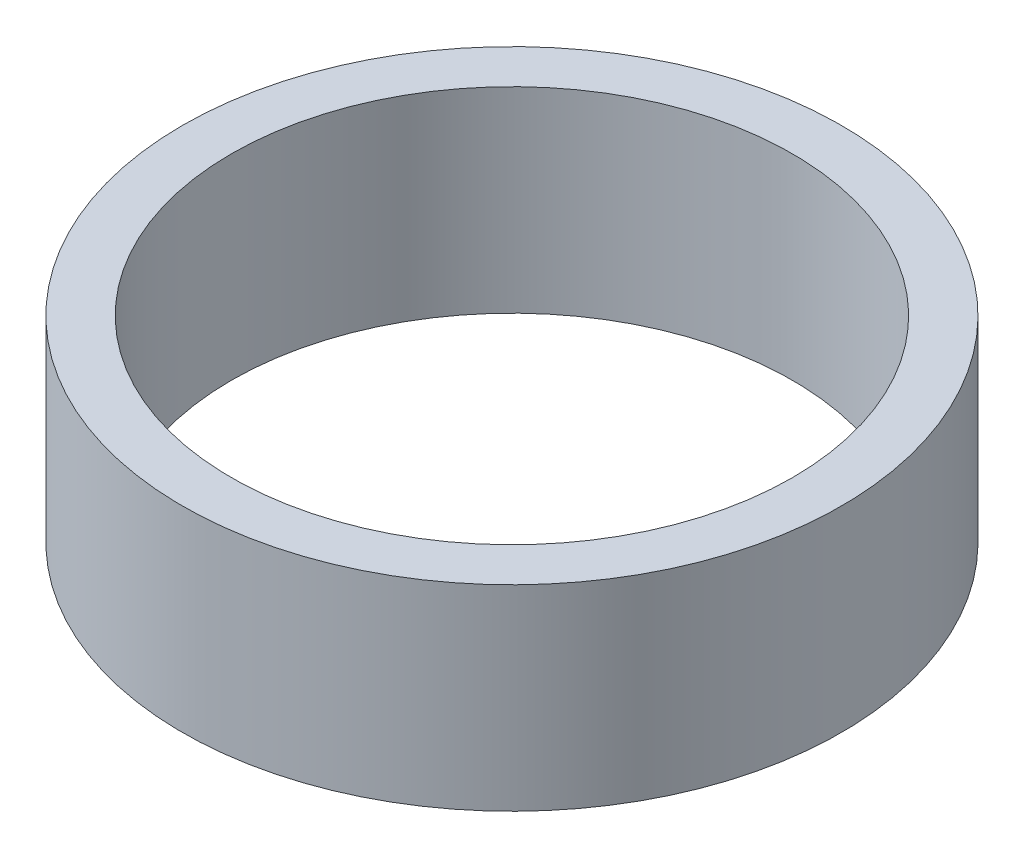
ISO-10303-21;
HEADER;
FILE_DESCRIPTION(('STEP AP214'),'2;1');
FILE_NAME('part.step','',(''),(''),'','','');
FILE_SCHEMA(('AUTOMOTIVE_DESIGN { 1 0 10303 214 1 1 1 1 }'));
ENDSEC;
DATA;
#1=APPLICATION_CONTEXT('core data for automotive mechanical design processes');
#2=APPLICATION_PROTOCOL_DEFINITION('international standard','automotive_design',2000,#1);
#3=PRODUCT_CONTEXT('',#1,'mechanical');
#4=PRODUCT('Part','Part','',(#3));
#5=PRODUCT_RELATED_PRODUCT_CATEGORY('part','',(#4));
#6=PRODUCT_DEFINITION_FORMATION('','',#4);
#7=PRODUCT_DEFINITION_CONTEXT('part definition',#1,'design');
#8=PRODUCT_DEFINITION('design','',#6,#7);
#9=PRODUCT_DEFINITION_SHAPE('','',#8);
#10=(LENGTH_UNIT() NAMED_UNIT(*) SI_UNIT(.MILLI.,.METRE.));
#11=(NAMED_UNIT(*) PLANE_ANGLE_UNIT() SI_UNIT($,.RADIAN.));
#12=(NAMED_UNIT(*) SI_UNIT($,.STERADIAN.) SOLID_ANGLE_UNIT());
#13=UNCERTAINTY_MEASURE_WITH_UNIT(LENGTH_MEASURE(1.E-05),#10,'distance_accuracy_value','');
#14=(GEOMETRIC_REPRESENTATION_CONTEXT(3) GLOBAL_UNCERTAINTY_ASSIGNED_CONTEXT((#13)) GLOBAL_UNIT_ASSIGNED_CONTEXT((#10,
#11,#12)) REPRESENTATION_CONTEXT('',''));
#15=CARTESIAN_POINT('',(0.,0.,0.));
#16=DIRECTION('',(0.,0.,1.));
#17=DIRECTION('',(1.,0.,0.));
#18=AXIS2_PLACEMENT_3D('',#15,#16,#17);
#19=CARTESIAN_POINT('',(42.672,0.,0.));
#20=DIRECTION('',(0.,1.,0.));
#21=DIRECTION('',(-1.,0.,0.));
#22=AXIS2_PLACEMENT_3D('',#19,#20,#21);
#23=PLANE('',#22);
#24=CARTESIAN_POINT('',(0.,0.,0.));
#25=DIRECTION('',(0.,1.,0.));
#26=DIRECTION('',(-1.,0.,0.));
#27=AXIS2_PLACEMENT_3D('',#24,#25,#26);
#28=CIRCLE('',#27,42.672);
#29=CARTESIAN_POINT('',(-42.672,0.,0.));
#30=VERTEX_POINT('',#29);
#31=EDGE_CURVE('E45',#30,#30,#28,.T.);
#32=ORIENTED_EDGE('',*,*,#31,.F.);
#33=EDGE_LOOP('',(#32));
#34=FACE_BOUND('',#33,.T.);
#35=CARTESIAN_POINT('',(0.,0.,0.));
#36=DIRECTION('',(0.,1.,0.));
#37=DIRECTION('',(-1.,0.,0.));
#38=AXIS2_PLACEMENT_3D('',#35,#36,#37);
#39=CIRCLE('',#38,36.322);
#40=CARTESIAN_POINT('',(-36.322,0.,0.));
#41=VERTEX_POINT('',#40);
#42=EDGE_CURVE('E10',#41,#41,#39,.T.);
#43=ORIENTED_EDGE('',*,*,#42,.T.);
#44=EDGE_LOOP('',(#43));
#45=FACE_BOUND('',#44,.T.);
#46=ADVANCED_FACE('F31',(#34,#45),#23,.F.);
#47=CARTESIAN_POINT('',(0.,25.4,0.));
#48=DIRECTION('',(0.,1.,0.));
#49=DIRECTION('',(-1.,0.,0.));
#50=AXIS2_PLACEMENT_3D('',#47,#48,#49);
#51=CYLINDRICAL_SURFACE('',#50,36.322);
#52=ORIENTED_EDGE('',*,*,#42,.F.);
#53=EDGE_LOOP('',(#52));
#54=FACE_BOUND('',#53,.T.);
#55=CARTESIAN_POINT('',(0.,25.4,0.));
#56=DIRECTION('',(0.,1.,0.));
#57=DIRECTION('',(-1.,0.,0.));
#58=AXIS2_PLACEMENT_3D('',#55,#56,#57);
#59=CIRCLE('',#58,36.322);
#60=CARTESIAN_POINT('',(-36.322,25.4,0.));
#61=VERTEX_POINT('',#60);
#62=EDGE_CURVE('E37',#61,#61,#59,.T.);
#63=ORIENTED_EDGE('',*,*,#62,.T.);
#64=EDGE_LOOP('',(#63));
#65=FACE_BOUND('',#64,.T.);
#66=ADVANCED_FACE('F54',(#54,#65),#51,.F.);
#67=CARTESIAN_POINT('',(36.322,25.4,0.));
#68=DIRECTION('',(0.,-1.,0.));
#69=DIRECTION('',(1.,0.,0.));
#70=AXIS2_PLACEMENT_3D('',#67,#68,#69);
#71=PLANE('',#70);
#72=ORIENTED_EDGE('',*,*,#62,.F.);
#73=EDGE_LOOP('',(#72));
#74=FACE_BOUND('',#73,.T.);
#75=CARTESIAN_POINT('',(0.,25.4,0.));
#76=DIRECTION('',(0.,1.,0.));
#77=DIRECTION('',(-1.,0.,0.));
#78=AXIS2_PLACEMENT_3D('',#75,#76,#77);
#79=CIRCLE('',#78,42.672);
#80=CARTESIAN_POINT('',(-42.672,25.4,0.));
#81=VERTEX_POINT('',#80);
#82=EDGE_CURVE('E41',#81,#81,#79,.T.);
#83=ORIENTED_EDGE('',*,*,#82,.T.);
#84=EDGE_LOOP('',(#83));
#85=FACE_BOUND('',#84,.T.);
#86=ADVANCED_FACE('F58',(#74,#85),#71,.F.);
#87=CARTESIAN_POINT('',(0.,25.4,0.));
#88=DIRECTION('',(0.,1.,0.));
#89=DIRECTION('',(-1.,0.,0.));
#90=AXIS2_PLACEMENT_3D('',#87,#88,#89);
#91=CYLINDRICAL_SURFACE('',#90,42.672);
#92=ORIENTED_EDGE('',*,*,#82,.F.);
#93=EDGE_LOOP('',(#92));
#94=FACE_BOUND('',#93,.T.);
#95=ORIENTED_EDGE('',*,*,#31,.T.);
#96=EDGE_LOOP('',(#95));
#97=FACE_BOUND('',#96,.T.);
#98=ADVANCED_FACE('F51',(#94,#97),#91,.T.);
#99=CLOSED_SHELL('',(#46,#66,#86,#98));
#100=MANIFOLD_SOLID_BREP('B2',#99);
#101=ADVANCED_BREP_SHAPE_REPRESENTATION('',(#18,#100),#14);
#102=SHAPE_DEFINITION_REPRESENTATION(#9,#101);
ENDSEC;
END-ISO-10303-21;
